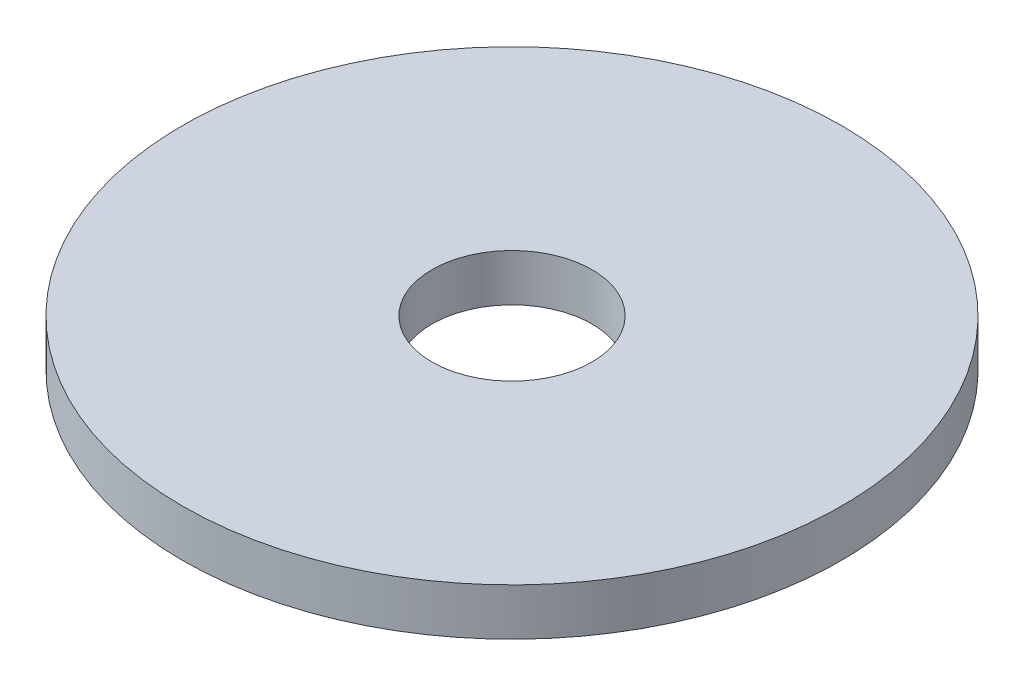
ISO-10303-21;
HEADER;
FILE_DESCRIPTION(('STEP AP214'),'2;1');
FILE_NAME('part.step','',(''),(''),'','','');
FILE_SCHEMA(('AUTOMOTIVE_DESIGN { 1 0 10303 214 1 1 1 1 }'));
ENDSEC;
DATA;
#1=APPLICATION_CONTEXT('core data for automotive mechanical design processes');
#2=APPLICATION_PROTOCOL_DEFINITION('international standard','automotive_design',2000,#1);
#3=PRODUCT_CONTEXT('',#1,'mechanical');
#4=PRODUCT('Part','Part','',(#3));
#5=PRODUCT_RELATED_PRODUCT_CATEGORY('part','',(#4));
#6=PRODUCT_DEFINITION_FORMATION('','',#4);
#7=PRODUCT_DEFINITION_CONTEXT('part definition',#1,'design');
#8=PRODUCT_DEFINITION('design','',#6,#7);
#9=PRODUCT_DEFINITION_SHAPE('','',#8);
#10=(LENGTH_UNIT() NAMED_UNIT(*) SI_UNIT(.MILLI.,.METRE.));
#11=(NAMED_UNIT(*) PLANE_ANGLE_UNIT() SI_UNIT($,.RADIAN.));
#12=(NAMED_UNIT(*) SI_UNIT($,.STERADIAN.) SOLID_ANGLE_UNIT());
#13=UNCERTAINTY_MEASURE_WITH_UNIT(LENGTH_MEASURE(1.E-05),#10,'distance_accuracy_value','');
#14=(GEOMETRIC_REPRESENTATION_CONTEXT(3) GLOBAL_UNCERTAINTY_ASSIGNED_CONTEXT((#13)) GLOBAL_UNIT_ASSIGNED_CONTEXT((#10,
#11,#12)) REPRESENTATION_CONTEXT('',''));
#15=CARTESIAN_POINT('',(0.,0.,0.));
#16=DIRECTION('',(0.,0.,1.));
#17=DIRECTION('',(1.,0.,0.));
#18=AXIS2_PLACEMENT_3D('',#15,#16,#17);
#19=CARTESIAN_POINT('',(0.,5.,0.));
#20=DIRECTION('',(0.,1.,0.));
#21=DIRECTION('',(0.,0.,1.));
#22=AXIS2_PLACEMENT_3D('',#19,#20,#21);
#23=PLANE('',#22);
#24=CARTESIAN_POINT('',(0.,5.,0.));
#25=DIRECTION('',(0.,1.,0.));
#26=DIRECTION('',(0.,0.,1.));
#27=AXIS2_PLACEMENT_3D('',#24,#25,#26);
#28=CIRCLE('',#27,35.);
#29=CARTESIAN_POINT('',(0.,5.,35.));
#30=VERTEX_POINT('',#29);
#31=EDGE_CURVE('E10',#30,#30,#28,.T.);
#32=ORIENTED_EDGE('',*,*,#31,.T.);
#33=EDGE_LOOP('',(#32));
#34=FACE_BOUND('',#33,.T.);
#35=CARTESIAN_POINT('',(0.,5.,0.));
#36=DIRECTION('',(0.,1.,0.));
#37=DIRECTION('',(0.,0.,1.));
#38=AXIS2_PLACEMENT_3D('',#35,#36,#37);
#39=CIRCLE('',#38,8.5);
#40=CARTESIAN_POINT('',(0.,5.,8.5));
#41=VERTEX_POINT('',#40);
#42=EDGE_CURVE('E42',#41,#41,#39,.T.);
#43=ORIENTED_EDGE('',*,*,#42,.F.);
#44=EDGE_LOOP('',(#43));
#45=FACE_BOUND('',#44,.T.);
#46=ADVANCED_FACE('F31',(#34,#45),#23,.T.);
#47=CARTESIAN_POINT('',(0.,0.,0.));
#48=DIRECTION('',(0.,1.,0.));
#49=DIRECTION('',(0.,0.,1.));
#50=AXIS2_PLACEMENT_3D('',#47,#48,#49);
#51=PLANE('',#50);
#52=CARTESIAN_POINT('',(0.,0.,0.));
#53=DIRECTION('',(0.,1.,0.));
#54=DIRECTION('',(0.,0.,1.));
#55=AXIS2_PLACEMENT_3D('',#52,#53,#54);
#56=CIRCLE('',#55,35.);
#57=CARTESIAN_POINT('',(0.,0.,35.));
#58=VERTEX_POINT('',#57);
#59=EDGE_CURVE('E35',#58,#58,#56,.T.);
#60=ORIENTED_EDGE('',*,*,#59,.F.);
#61=EDGE_LOOP('',(#60));
#62=FACE_BOUND('',#61,.T.);
#63=CARTESIAN_POINT('',(0.,0.,0.));
#64=DIRECTION('',(0.,1.,0.));
#65=DIRECTION('',(0.,0.,1.));
#66=AXIS2_PLACEMENT_3D('',#63,#64,#65);
#67=CIRCLE('',#66,8.5);
#68=CARTESIAN_POINT('',(0.,0.,8.5));
#69=VERTEX_POINT('',#68);
#70=EDGE_CURVE('E44',#69,#69,#67,.T.);
#71=ORIENTED_EDGE('',*,*,#70,.T.);
#72=EDGE_LOOP('',(#71));
#73=FACE_BOUND('',#72,.T.);
#74=ADVANCED_FACE('F54',(#62,#73),#51,.F.);
#75=CARTESIAN_POINT('',(0.,5.,0.));
#76=DIRECTION('',(0.,-1.,0.));
#77=DIRECTION('',(0.,0.,-1.));
#78=AXIS2_PLACEMENT_3D('',#75,#76,#77);
#79=CYLINDRICAL_SURFACE('',#78,35.);
#80=ORIENTED_EDGE('',*,*,#31,.F.);
#81=EDGE_LOOP('',(#80));
#82=FACE_BOUND('',#81,.T.);
#83=ORIENTED_EDGE('',*,*,#59,.T.);
#84=EDGE_LOOP('',(#83));
#85=FACE_BOUND('',#84,.T.);
#86=ADVANCED_FACE('F33',(#82,#85),#79,.T.);
#87=CARTESIAN_POINT('',(0.,5.,0.));
#88=DIRECTION('',(0.,-1.,0.));
#89=DIRECTION('',(0.,0.,-1.));
#90=AXIS2_PLACEMENT_3D('',#87,#88,#89);
#91=CYLINDRICAL_SURFACE('',#90,8.5);
#92=ORIENTED_EDGE('',*,*,#42,.T.);
#93=EDGE_LOOP('',(#92));
#94=FACE_BOUND('',#93,.T.);
#95=ORIENTED_EDGE('',*,*,#70,.F.);
#96=EDGE_LOOP('',(#95));
#97=FACE_BOUND('',#96,.T.);
#98=ADVANCED_FACE('F50',(#94,#97),#91,.F.);
#99=CLOSED_SHELL('',(#46,#74,#86,#98));
#100=MANIFOLD_SOLID_BREP('B2',#99);
#101=ADVANCED_BREP_SHAPE_REPRESENTATION('',(#18,#100),#14);
#102=SHAPE_DEFINITION_REPRESENTATION(#9,#101);
ENDSEC;
END-ISO-10303-21;
